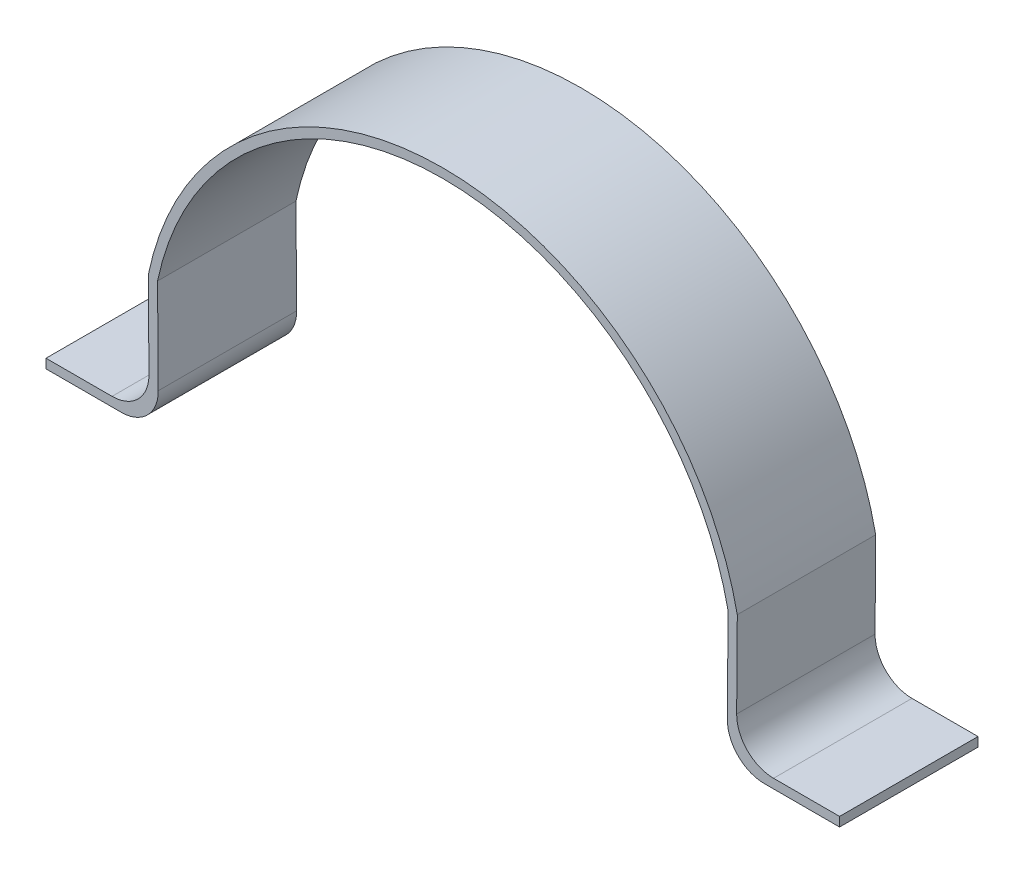
ISO-10303-21;
HEADER;
FILE_DESCRIPTION(('STEP AP214'),'2;1');
FILE_NAME('part.step','',(''),(''),'','','');
FILE_SCHEMA(('AUTOMOTIVE_DESIGN { 1 0 10303 214 1 1 1 1 }'));
ENDSEC;
DATA;
#1=APPLICATION_CONTEXT('core data for automotive mechanical design processes');
#2=APPLICATION_PROTOCOL_DEFINITION('international standard','automotive_design',2000,#1);
#3=PRODUCT_CONTEXT('',#1,'mechanical');
#4=PRODUCT('Part','Part','',(#3));
#5=PRODUCT_RELATED_PRODUCT_CATEGORY('part','',(#4));
#6=PRODUCT_DEFINITION_FORMATION('','',#4);
#7=PRODUCT_DEFINITION_CONTEXT('part definition',#1,'design');
#8=PRODUCT_DEFINITION('design','',#6,#7);
#9=PRODUCT_DEFINITION_SHAPE('','',#8);
#10=(LENGTH_UNIT() NAMED_UNIT(*) SI_UNIT(.MILLI.,.METRE.));
#11=(NAMED_UNIT(*) PLANE_ANGLE_UNIT() SI_UNIT($,.RADIAN.));
#12=(NAMED_UNIT(*) SI_UNIT($,.STERADIAN.) SOLID_ANGLE_UNIT());
#13=UNCERTAINTY_MEASURE_WITH_UNIT(LENGTH_MEASURE(1.E-05),#10,'distance_accuracy_value','');
#14=(GEOMETRIC_REPRESENTATION_CONTEXT(3) GLOBAL_UNCERTAINTY_ASSIGNED_CONTEXT((#13)) GLOBAL_UNIT_ASSIGNED_CONTEXT((#10,
#11,#12)) REPRESENTATION_CONTEXT('',''));
#15=CARTESIAN_POINT('',(0.,0.,0.));
#16=DIRECTION('',(0.,0.,1.));
#17=DIRECTION('',(1.,0.,0.));
#18=AXIS2_PLACEMENT_3D('',#15,#16,#17);
#19=CARTESIAN_POINT('',(31.8191099342966,-7.78341995733945,15.));
#20=DIRECTION('',(0.,1.,0.));
#21=DIRECTION('',(-1.,0.,0.));
#22=AXIS2_PLACEMENT_3D('',#19,#20,#21);
#23=PLANE('',#22);
#24=DIRECTION('',(1.,0.,0.));
#25=VECTOR('',#24,1.);
#26=CARTESIAN_POINT('',(31.8191099342966,-7.78341995733945,15.));
#27=LINE('',#26,#25);
#28=CARTESIAN_POINT('',(34.8414250496166,-7.78341995733945,15.));
#29=VERTEX_POINT('',#28);
#30=CARTESIAN_POINT('',(43.0073590981149,-7.78341995733945,15.));
#31=VERTEX_POINT('',#30);
#32=EDGE_CURVE('E143',#29,#31,#27,.T.);
#33=ORIENTED_EDGE('',*,*,#32,.F.);
#34=DIRECTION('',(0.,0.,-1.));
#35=VECTOR('',#34,1.);
#36=CARTESIAN_POINT('',(34.8414250496166,-7.78341995733945,15.));
#37=LINE('',#36,#35);
#38=CARTESIAN_POINT('',(34.8414250496166,-7.78341995733945,0.));
#39=VERTEX_POINT('',#38);
#40=EDGE_CURVE('E255',#29,#39,#37,.T.);
#41=ORIENTED_EDGE('',*,*,#40,.T.);
#42=DIRECTION('',(1.,0.,0.));
#43=VECTOR('',#42,1.);
#44=CARTESIAN_POINT('',(31.8191099342966,-7.78341995733945,0.));
#45=LINE('',#44,#43);
#46=CARTESIAN_POINT('',(43.0073590981149,-7.78341995733945,0.));
#47=VERTEX_POINT('',#46);
#48=EDGE_CURVE('E158',#39,#47,#45,.T.);
#49=ORIENTED_EDGE('',*,*,#48,.T.);
#50=DIRECTION('',(0.,0.,-1.));
#51=VECTOR('',#50,1.);
#52=CARTESIAN_POINT('',(43.0073590981149,-7.78341995733945,15.));
#53=LINE('',#52,#51);
#54=EDGE_CURVE('E156',#31,#47,#53,.T.);
#55=ORIENTED_EDGE('',*,*,#54,.F.);
#56=EDGE_LOOP('',(#33,#41,#49,#55));
#57=FACE_BOUND('',#56,.T.);
#58=ADVANCED_FACE('F31',(#57),#23,.F.);
#59=CARTESIAN_POINT('',(43.0073590981149,-6.78341995733945,15.));
#60=DIRECTION('',(1.,0.,0.));
#61=DIRECTION('',(0.,0.,-1.));
#62=AXIS2_PLACEMENT_3D('',#59,#60,#61);
#63=PLANE('',#62);
#64=DIRECTION('',(0.,-1.,0.));
#65=VECTOR('',#64,1.);
#66=CARTESIAN_POINT('',(43.0073590981149,-6.78341995733945,0.));
#67=LINE('',#66,#65);
#68=CARTESIAN_POINT('',(43.0073590981149,-6.78341995733945,0.));
#69=VERTEX_POINT('',#68);
#70=EDGE_CURVE('E197',#69,#47,#67,.T.);
#71=ORIENTED_EDGE('',*,*,#70,.F.);
#72=DIRECTION('',(0.,0.,-1.));
#73=VECTOR('',#72,1.);
#74=CARTESIAN_POINT('',(43.0073590981149,-6.78341995733945,15.));
#75=LINE('',#74,#73);
#76=CARTESIAN_POINT('',(43.0073590981149,-6.78341995733945,15.));
#77=VERTEX_POINT('',#76);
#78=EDGE_CURVE('E163',#77,#69,#75,.T.);
#79=ORIENTED_EDGE('',*,*,#78,.F.);
#80=DIRECTION('',(0.,-1.,0.));
#81=VECTOR('',#80,1.);
#82=CARTESIAN_POINT('',(43.0073590981149,-6.78341995733945,15.));
#83=LINE('',#82,#81);
#84=EDGE_CURVE('E148',#77,#31,#83,.T.);
#85=ORIENTED_EDGE('',*,*,#84,.T.);
#86=ORIENTED_EDGE('',*,*,#54,.T.);
#87=EDGE_LOOP('',(#71,#79,#85,#86));
#88=FACE_BOUND('',#87,.T.);
#89=ADVANCED_FACE('F166',(#88),#63,.T.);
#90=CARTESIAN_POINT('',(31.8191099342966,-6.78341995733945,15.));
#91=DIRECTION('',(0.,1.,0.));
#92=DIRECTION('',(-1.,0.,0.));
#93=AXIS2_PLACEMENT_3D('',#90,#91,#92);
#94=PLANE('',#93);
#95=DIRECTION('',(1.,0.,0.));
#96=VECTOR('',#95,1.);
#97=CARTESIAN_POINT('',(31.8191099342966,-6.78341995733945,0.));
#98=LINE('',#97,#96);
#99=CARTESIAN_POINT('',(35.8488634213899,-6.78341995733945,0.));
#100=VERTEX_POINT('',#99);
#101=EDGE_CURVE('E199',#100,#69,#98,.T.);
#102=ORIENTED_EDGE('',*,*,#101,.F.);
#103=DIRECTION('',(0.,0.,-1.));
#104=VECTOR('',#103,1.);
#105=CARTESIAN_POINT('',(35.8488634213899,-6.78341995733945,15.));
#106=LINE('',#105,#104);
#107=CARTESIAN_POINT('',(35.8488634213899,-6.78341995733945,15.));
#108=VERTEX_POINT('',#107);
#109=EDGE_CURVE('E46',#100,#108,#106,.F.);
#110=ORIENTED_EDGE('',*,*,#109,.T.);
#111=DIRECTION('',(1.,0.,0.));
#112=VECTOR('',#111,1.);
#113=CARTESIAN_POINT('',(31.8191099342966,-6.78341995733945,15.));
#114=LINE('',#113,#112);
#115=EDGE_CURVE('E168',#108,#77,#114,.T.);
#116=ORIENTED_EDGE('',*,*,#115,.T.);
#117=ORIENTED_EDGE('',*,*,#78,.T.);
#118=EDGE_LOOP('',(#102,#110,#116,#117));
#119=FACE_BOUND('',#118,.T.);
#120=ADVANCED_FACE('F290',(#119),#94,.T.);
#121=CARTESIAN_POINT('',(31.9183647004848,6.6096381353255,15.));
#122=DIRECTION('',(0.999972540327596,-0.00741070784566578,0.));
#123=DIRECTION('',(0.00741070784566579,0.999972540327596,0.));
#124=AXIS2_PLACEMENT_3D('',#121,#122,#123);
#125=PLANE('',#124);
#126=DIRECTION('',(-0.00741070784566579,-0.999972540327596,0.));
#127=VECTOR('',#126,1.);
#128=CARTESIAN_POINT('',(31.9183647004848,6.6096381353255,15.));
#129=LINE('',#128,#127);
#130=CARTESIAN_POINT('',(31.9183647004848,6.6096381353255,15.));
#131=VERTEX_POINT('',#130);
#132=CARTESIAN_POINT('',(31.8489732600795,-2.75377712595679,15.));
#133=VERTEX_POINT('',#132);
#134=EDGE_CURVE('E170',#131,#133,#129,.T.);
#135=ORIENTED_EDGE('',*,*,#134,.T.);
#136=DIRECTION('',(0.,0.,-1.));
#137=VECTOR('',#136,1.);
#138=CARTESIAN_POINT('',(31.8489732600795,-2.75377712595679,0.));
#139=LINE('',#138,#137);
#140=CARTESIAN_POINT('',(31.8489732600795,-2.75377712595679,0.));
#141=VERTEX_POINT('',#140);
#142=EDGE_CURVE('E259',#133,#141,#139,.T.);
#143=ORIENTED_EDGE('',*,*,#142,.T.);
#144=DIRECTION('',(-0.00741070784566579,-0.999972540327596,0.));
#145=VECTOR('',#144,1.);
#146=CARTESIAN_POINT('',(31.9183647004848,6.6096381353255,0.));
#147=LINE('',#146,#145);
#148=CARTESIAN_POINT('',(31.9183647004848,6.6096381353255,0.));
#149=VERTEX_POINT('',#148);
#150=EDGE_CURVE('E201',#149,#141,#147,.T.);
#151=ORIENTED_EDGE('',*,*,#150,.F.);
#152=DIRECTION('',(0.,0.,-1.));
#153=VECTOR('',#152,1.);
#154=CARTESIAN_POINT('',(31.9183647004848,6.6096381353255,15.));
#155=LINE('',#154,#153);
#156=EDGE_CURVE('E235',#131,#149,#155,.T.);
#157=ORIENTED_EDGE('',*,*,#156,.F.);
#158=EDGE_LOOP('',(#135,#143,#151,#157));
#159=FACE_BOUND('',#158,.T.);
#160=ADVANCED_FACE('F350',(#159),#125,.T.);
#161=CARTESIAN_POINT('',(0.,0.,15.));
#162=DIRECTION('',(0.,0.,-1.));
#163=DIRECTION('',(-1.,0.,0.));
#164=AXIS2_PLACEMENT_3D('',#161,#162,#163);
#165=CYLINDRICAL_SURFACE('',#164,32.5955414348819);
#166=CARTESIAN_POINT('',(0.,0.,0.));
#167=DIRECTION('',(0.,0.,-1.));
#168=DIRECTION('',(1.,0.,0.));
#169=AXIS2_PLACEMENT_3D('',#166,#167,#168);
#170=CIRCLE('',#169,32.5955414348819);
#171=CARTESIAN_POINT('',(-31.9183647004848,6.6096381353255,0.));
#172=VERTEX_POINT('',#171);
#173=EDGE_CURVE('E203',#172,#149,#170,.T.);
#174=ORIENTED_EDGE('',*,*,#173,.F.);
#175=DIRECTION('',(0.,0.,-1.));
#176=VECTOR('',#175,1.);
#177=CARTESIAN_POINT('',(-31.9183647004848,6.6096381353255,15.));
#178=LINE('',#177,#176);
#179=CARTESIAN_POINT('',(-31.9183647004848,6.6096381353255,15.));
#180=VERTEX_POINT('',#179);
#181=EDGE_CURVE('E232',#180,#172,#178,.T.);
#182=ORIENTED_EDGE('',*,*,#181,.F.);
#183=CARTESIAN_POINT('',(0.,0.,15.));
#184=DIRECTION('',(0.,0.,-1.));
#185=DIRECTION('',(1.,0.,0.));
#186=AXIS2_PLACEMENT_3D('',#183,#184,#185);
#187=CIRCLE('',#186,32.5955414348819);
#188=EDGE_CURVE('E175',#180,#131,#187,.T.);
#189=ORIENTED_EDGE('',*,*,#188,.T.);
#190=ORIENTED_EDGE('',*,*,#156,.T.);
#191=EDGE_LOOP('',(#174,#182,#189,#190));
#192=FACE_BOUND('',#191,.T.);
#193=ADVANCED_FACE('F346',(#192),#165,.T.);
#194=CARTESIAN_POINT('',(-31.9183647004848,6.6096381353255,15.));
#195=DIRECTION('',(-0.999972540327596,-0.00741070784566578,0.));
#196=DIRECTION('',(0.00741070784566579,-0.999972540327596,0.));
#197=AXIS2_PLACEMENT_3D('',#194,#195,#196);
#198=PLANE('',#197);
#199=DIRECTION('',(-0.00741070784566579,0.999972540327596,0.));
#200=VECTOR('',#199,1.);
#201=CARTESIAN_POINT('',(-31.9183647004848,6.6096381353255,0.));
#202=LINE('',#201,#200);
#203=CARTESIAN_POINT('',(-31.8489732600795,-2.75377712595679,0.));
#204=VERTEX_POINT('',#203);
#205=EDGE_CURVE('E206',#204,#172,#202,.T.);
#206=ORIENTED_EDGE('',*,*,#205,.F.);
#207=DIRECTION('',(0.,0.,-1.));
#208=VECTOR('',#207,1.);
#209=CARTESIAN_POINT('',(-31.8489732600795,-2.75377712595679,15.));
#210=LINE('',#209,#208);
#211=CARTESIAN_POINT('',(-31.8489732600795,-2.75377712595679,15.));
#212=VERTEX_POINT('',#211);
#213=EDGE_CURVE('E240',#204,#212,#210,.F.);
#214=ORIENTED_EDGE('',*,*,#213,.T.);
#215=DIRECTION('',(-0.00741070784566579,0.999972540327596,0.));
#216=VECTOR('',#215,1.);
#217=CARTESIAN_POINT('',(-31.9183647004848,6.6096381353255,15.));
#218=LINE('',#217,#216);
#219=EDGE_CURVE('E178',#212,#180,#218,.T.);
#220=ORIENTED_EDGE('',*,*,#219,.T.);
#221=ORIENTED_EDGE('',*,*,#181,.T.);
#222=EDGE_LOOP('',(#206,#214,#220,#221));
#223=FACE_BOUND('',#222,.T.);
#224=ADVANCED_FACE('F343',(#223),#198,.T.);
#225=CARTESIAN_POINT('',(-31.8191099342966,-6.78341995733945,15.));
#226=DIRECTION('',(0.,1.,0.));
#227=DIRECTION('',(-1.,0.,0.));
#228=AXIS2_PLACEMENT_3D('',#225,#226,#227);
#229=PLANE('',#228);
#230=DIRECTION('',(1.,0.,0.));
#231=VECTOR('',#230,1.);
#232=CARTESIAN_POINT('',(-31.8191099342966,-6.78341995733945,15.));
#233=LINE('',#232,#231);
#234=CARTESIAN_POINT('',(-43.0073590981149,-6.78341995733945,15.));
#235=VERTEX_POINT('',#234);
#236=CARTESIAN_POINT('',(-35.8488634213899,-6.78341995733945,15.));
#237=VERTEX_POINT('',#236);
#238=EDGE_CURVE('E180',#235,#237,#233,.T.);
#239=ORIENTED_EDGE('',*,*,#238,.T.);
#240=DIRECTION('',(0.,0.,-1.));
#241=VECTOR('',#240,1.);
#242=CARTESIAN_POINT('',(-35.8488634213899,-6.78341995733945,0.));
#243=LINE('',#242,#241);
#244=CARTESIAN_POINT('',(-35.8488634213899,-6.78341995733945,0.));
#245=VERTEX_POINT('',#244);
#246=EDGE_CURVE('E162',#237,#245,#243,.T.);
#247=ORIENTED_EDGE('',*,*,#246,.T.);
#248=DIRECTION('',(1.,0.,0.));
#249=VECTOR('',#248,1.);
#250=CARTESIAN_POINT('',(-31.8191099342966,-6.78341995733945,0.));
#251=LINE('',#250,#249);
#252=CARTESIAN_POINT('',(-43.0073590981149,-6.78341995733945,0.));
#253=VERTEX_POINT('',#252);
#254=EDGE_CURVE('E208',#253,#245,#251,.T.);
#255=ORIENTED_EDGE('',*,*,#254,.F.);
#256=DIRECTION('',(0.,0.,-1.));
#257=VECTOR('',#256,1.);
#258=CARTESIAN_POINT('',(-43.0073590981149,-6.78341995733945,15.));
#259=LINE('',#258,#257);
#260=EDGE_CURVE('E230',#235,#253,#259,.T.);
#261=ORIENTED_EDGE('',*,*,#260,.F.);
#262=EDGE_LOOP('',(#239,#247,#255,#261));
#263=FACE_BOUND('',#262,.T.);
#264=ADVANCED_FACE('F308',(#263),#229,.T.);
#265=CARTESIAN_POINT('',(-43.0073590981149,-7.78341995733945,15.));
#266=DIRECTION('',(-1.,0.,0.));
#267=DIRECTION('',(0.,0.,1.));
#268=AXIS2_PLACEMENT_3D('',#265,#266,#267);
#269=PLANE('',#268);
#270=DIRECTION('',(0.,1.,0.));
#271=VECTOR('',#270,1.);
#272=CARTESIAN_POINT('',(-43.0073590981149,-7.78341995733945,0.));
#273=LINE('',#272,#271);
#274=CARTESIAN_POINT('',(-43.0073590981149,-7.78341995733945,0.));
#275=VERTEX_POINT('',#274);
#276=EDGE_CURVE('E211',#275,#253,#273,.T.);
#277=ORIENTED_EDGE('',*,*,#276,.F.);
#278=DIRECTION('',(0.,0.,-1.));
#279=VECTOR('',#278,1.);
#280=CARTESIAN_POINT('',(-43.0073590981149,-7.78341995733945,15.));
#281=LINE('',#280,#279);
#282=CARTESIAN_POINT('',(-43.0073590981149,-7.78341995733945,15.));
#283=VERTEX_POINT('',#282);
#284=EDGE_CURVE('E228',#283,#275,#281,.T.);
#285=ORIENTED_EDGE('',*,*,#284,.F.);
#286=DIRECTION('',(0.,1.,0.));
#287=VECTOR('',#286,1.);
#288=CARTESIAN_POINT('',(-43.0073590981149,-7.78341995733945,15.));
#289=LINE('',#288,#287);
#290=EDGE_CURVE('E183',#283,#235,#289,.T.);
#291=ORIENTED_EDGE('',*,*,#290,.T.);
#292=ORIENTED_EDGE('',*,*,#260,.T.);
#293=EDGE_LOOP('',(#277,#285,#291,#292));
#294=FACE_BOUND('',#293,.T.);
#295=ADVANCED_FACE('F312',(#294),#269,.T.);
#296=CARTESIAN_POINT('',(-31.8191099342966,-7.78341995733945,15.));
#297=DIRECTION('',(0.,1.,0.));
#298=DIRECTION('',(-1.,0.,0.));
#299=AXIS2_PLACEMENT_3D('',#296,#297,#298);
#300=PLANE('',#299);
#301=DIRECTION('',(1.,0.,0.));
#302=VECTOR('',#301,1.);
#303=CARTESIAN_POINT('',(-31.8191099342966,-7.78341995733945,0.));
#304=LINE('',#303,#302);
#305=CARTESIAN_POINT('',(-34.8414250496166,-7.78341995733945,0.));
#306=VERTEX_POINT('',#305);
#307=EDGE_CURVE('E214',#275,#306,#304,.T.);
#308=ORIENTED_EDGE('',*,*,#307,.T.);
#309=DIRECTION('',(0.,0.,-1.));
#310=VECTOR('',#309,1.);
#311=CARTESIAN_POINT('',(-34.8414250496166,-7.78341995733945,15.));
#312=LINE('',#311,#310);
#313=CARTESIAN_POINT('',(-34.8414250496166,-7.78341995733945,15.));
#314=VERTEX_POINT('',#313);
#315=EDGE_CURVE('E251',#306,#314,#312,.F.);
#316=ORIENTED_EDGE('',*,*,#315,.T.);
#317=DIRECTION('',(1.,0.,0.));
#318=VECTOR('',#317,1.);
#319=CARTESIAN_POINT('',(-31.8191099342966,-7.78341995733945,15.));
#320=LINE('',#319,#318);
#321=EDGE_CURVE('E186',#283,#314,#320,.T.);
#322=ORIENTED_EDGE('',*,*,#321,.F.);
#323=ORIENTED_EDGE('',*,*,#284,.T.);
#324=EDGE_LOOP('',(#308,#316,#322,#323));
#325=FACE_BOUND('',#324,.T.);
#326=ADVANCED_FACE('F334',(#325),#300,.F.);
#327=CARTESIAN_POINT('',(-30.9183921601572,6.61704884317116,15.));
#328=DIRECTION('',(-0.999972540327596,-0.00741070784566578,0.));
#329=DIRECTION('',(0.00741070784566578,-0.999972540327596,0.));
#330=AXIS2_PLACEMENT_3D('',#327,#328,#329);
#331=PLANE('',#330);
#332=DIRECTION('',(-0.00741070784566578,0.999972540327596,0.));
#333=VECTOR('',#332,1.);
#334=CARTESIAN_POINT('',(-30.9183921601572,6.61704884317116,15.));
#335=LINE('',#334,#333);
#336=CARTESIAN_POINT('',(-30.8415348883062,-3.75377712595679,15.));
#337=VERTEX_POINT('',#336);
#338=CARTESIAN_POINT('',(-30.9175989522455,6.51001640485201,15.));
#339=VERTEX_POINT('',#338);
#340=EDGE_CURVE('E189',#337,#339,#335,.T.);
#341=ORIENTED_EDGE('',*,*,#340,.F.);
#342=DIRECTION('',(0.,0.,-1.));
#343=VECTOR('',#342,1.);
#344=CARTESIAN_POINT('',(-30.8415348883062,-3.75377712595679,15.));
#345=LINE('',#344,#343);
#346=CARTESIAN_POINT('',(-30.8415348883062,-3.75377712595679,0.));
#347=VERTEX_POINT('',#346);
#348=EDGE_CURVE('E246',#337,#347,#345,.T.);
#349=ORIENTED_EDGE('',*,*,#348,.T.);
#350=DIRECTION('',(-0.00741070784566578,0.999972540327596,0.));
#351=VECTOR('',#350,1.);
#352=CARTESIAN_POINT('',(-30.9183921601572,6.61704884317116,0.));
#353=LINE('',#352,#351);
#354=CARTESIAN_POINT('',(-30.9175989522455,6.51001640485201,0.));
#355=VERTEX_POINT('',#354);
#356=EDGE_CURVE('E217',#347,#355,#353,.T.);
#357=ORIENTED_EDGE('',*,*,#356,.T.);
#358=DIRECTION('',(0.,0.,-1.));
#359=VECTOR('',#358,1.);
#360=CARTESIAN_POINT('',(-30.9175989522455,6.51001640485201,15.));
#361=LINE('',#360,#359);
#362=EDGE_CURVE('E225',#339,#355,#361,.T.);
#363=ORIENTED_EDGE('',*,*,#362,.F.);
#364=EDGE_LOOP('',(#341,#349,#357,#363));
#365=FACE_BOUND('',#364,.T.);
#366=ADVANCED_FACE('F321',(#365),#331,.F.);
#367=CARTESIAN_POINT('',(0.,0.,15.));
#368=DIRECTION('',(0.,0.,-1.));
#369=DIRECTION('',(-1.,0.,0.));
#370=AXIS2_PLACEMENT_3D('',#367,#368,#369);
#371=CYLINDRICAL_SURFACE('',#370,31.5955414348819);
#372=CARTESIAN_POINT('',(0.,0.,0.));
#373=DIRECTION('',(0.,0.,1.));
#374=DIRECTION('',(1.,0.,0.));
#375=AXIS2_PLACEMENT_3D('',#372,#373,#374);
#376=CIRCLE('',#375,31.5955414348819);
#377=CARTESIAN_POINT('',(30.9175989522455,6.51001640485201,0.));
#378=VERTEX_POINT('',#377);
#379=EDGE_CURVE('E219',#355,#378,#376,.F.);
#380=ORIENTED_EDGE('',*,*,#379,.T.);
#381=DIRECTION('',(0.,0.,-1.));
#382=VECTOR('',#381,1.);
#383=CARTESIAN_POINT('',(30.9175989522455,6.51001640485201,15.));
#384=LINE('',#383,#382);
#385=CARTESIAN_POINT('',(30.9175989522455,6.51001640485201,15.));
#386=VERTEX_POINT('',#385);
#387=EDGE_CURVE('E195',#386,#378,#384,.T.);
#388=ORIENTED_EDGE('',*,*,#387,.F.);
#389=CARTESIAN_POINT('',(0.,0.,15.));
#390=DIRECTION('',(0.,0.,1.));
#391=DIRECTION('',(1.,0.,0.));
#392=AXIS2_PLACEMENT_3D('',#389,#390,#391);
#393=CIRCLE('',#392,31.5955414348819);
#394=EDGE_CURVE('E191',#339,#386,#393,.F.);
#395=ORIENTED_EDGE('',*,*,#394,.F.);
#396=ORIENTED_EDGE('',*,*,#362,.T.);
#397=EDGE_LOOP('',(#380,#388,#395,#396));
#398=FACE_BOUND('',#397,.T.);
#399=ADVANCED_FACE('F325',(#398),#371,.F.);
#400=CARTESIAN_POINT('',(30.9183921601572,6.61704884317116,15.));
#401=DIRECTION('',(0.999972540327596,-0.00741070784566578,0.));
#402=DIRECTION('',(0.00741070784566578,0.999972540327596,0.));
#403=AXIS2_PLACEMENT_3D('',#400,#401,#402);
#404=PLANE('',#403);
#405=DIRECTION('',(-0.00741070784566578,-0.999972540327596,0.));
#406=VECTOR('',#405,1.);
#407=CARTESIAN_POINT('',(30.9183921601572,6.61704884317116,0.));
#408=LINE('',#407,#406);
#409=CARTESIAN_POINT('',(30.8415348883062,-3.75377712595679,0.));
#410=VERTEX_POINT('',#409);
#411=EDGE_CURVE('E153',#378,#410,#408,.T.);
#412=ORIENTED_EDGE('',*,*,#411,.T.);
#413=DIRECTION('',(0.,0.,-1.));
#414=VECTOR('',#413,1.);
#415=CARTESIAN_POINT('',(30.8415348883062,-3.75377712595679,15.));
#416=LINE('',#415,#414);
#417=CARTESIAN_POINT('',(30.8415348883062,-3.75377712595679,15.));
#418=VERTEX_POINT('',#417);
#419=EDGE_CURVE('E257',#410,#418,#416,.F.);
#420=ORIENTED_EDGE('',*,*,#419,.T.);
#421=DIRECTION('',(-0.00741070784566578,-0.999972540327596,0.));
#422=VECTOR('',#421,1.);
#423=CARTESIAN_POINT('',(30.9183921601572,6.61704884317116,15.));
#424=LINE('',#423,#422);
#425=EDGE_CURVE('E193',#386,#418,#424,.T.);
#426=ORIENTED_EDGE('',*,*,#425,.F.);
#427=ORIENTED_EDGE('',*,*,#387,.T.);
#428=EDGE_LOOP('',(#412,#420,#426,#427));
#429=FACE_BOUND('',#428,.T.);
#430=ADVANCED_FACE('F271',(#429),#404,.F.);
#431=CARTESIAN_POINT('',(0.,0.,15.));
#432=DIRECTION('',(0.,0.,-1.));
#433=DIRECTION('',(-1.,0.,0.));
#434=AXIS2_PLACEMENT_3D('',#431,#432,#433);
#435=PLANE('',#434);
#436=ORIENTED_EDGE('',*,*,#425,.T.);
#437=CARTESIAN_POINT('',(34.8414250496166,-3.78341995733945,15.));
#438=DIRECTION('',(0.,0.,-1.));
#439=DIRECTION('',(-1.,0.,0.));
#440=AXIS2_PLACEMENT_3D('',#437,#438,#439);
#441=CIRCLE('',#440,4.);
#442=EDGE_CURVE('E11',#418,#29,#441,.F.);
#443=ORIENTED_EDGE('',*,*,#442,.T.);
#444=ORIENTED_EDGE('',*,*,#32,.T.);
#445=ORIENTED_EDGE('',*,*,#84,.F.);
#446=ORIENTED_EDGE('',*,*,#115,.F.);
#447=CARTESIAN_POINT('',(35.8488634213899,-2.78341995733945,15.));
#448=DIRECTION('',(0.,0.,-1.));
#449=DIRECTION('',(-1.,0.,0.));
#450=AXIS2_PLACEMENT_3D('',#447,#448,#449);
#451=CIRCLE('',#450,4.);
#452=EDGE_CURVE('E264',#108,#133,#451,.T.);
#453=ORIENTED_EDGE('',*,*,#452,.T.);
#454=ORIENTED_EDGE('',*,*,#134,.F.);
#455=ORIENTED_EDGE('',*,*,#188,.F.);
#456=ORIENTED_EDGE('',*,*,#219,.F.);
#457=CARTESIAN_POINT('',(-35.8488634213899,-2.78341995733945,15.));
#458=DIRECTION('',(0.,0.,-1.));
#459=DIRECTION('',(-1.,0.,0.));
#460=AXIS2_PLACEMENT_3D('',#457,#458,#459);
#461=CIRCLE('',#460,4.);
#462=EDGE_CURVE('E244',#212,#237,#461,.T.);
#463=ORIENTED_EDGE('',*,*,#462,.T.);
#464=ORIENTED_EDGE('',*,*,#238,.F.);
#465=ORIENTED_EDGE('',*,*,#290,.F.);
#466=ORIENTED_EDGE('',*,*,#321,.T.);
#467=CARTESIAN_POINT('',(-34.8414250496166,-3.78341995733945,15.));
#468=DIRECTION('',(0.,0.,-1.));
#469=DIRECTION('',(-1.,0.,0.));
#470=AXIS2_PLACEMENT_3D('',#467,#468,#469);
#471=CIRCLE('',#470,4.);
#472=EDGE_CURVE('E253',#314,#337,#471,.F.);
#473=ORIENTED_EDGE('',*,*,#472,.T.);
#474=ORIENTED_EDGE('',*,*,#340,.T.);
#475=ORIENTED_EDGE('',*,*,#394,.T.);
#476=EDGE_LOOP('',(#436,#443,#444,#445,#446,#453,#454,#455,#456,#463,#464,#465,#466,#473,#474,#475));
#477=FACE_BOUND('',#476,.T.);
#478=ADVANCED_FACE('F146',(#477),#435,.F.);
#479=CARTESIAN_POINT('',(0.,0.,0.));
#480=DIRECTION('',(0.,0.,-1.));
#481=DIRECTION('',(-1.,0.,0.));
#482=AXIS2_PLACEMENT_3D('',#479,#480,#481);
#483=PLANE('',#482);
#484=ORIENTED_EDGE('',*,*,#48,.F.);
#485=CARTESIAN_POINT('',(34.8414250496166,-3.78341995733945,0.));
#486=DIRECTION('',(0.,0.,-1.));
#487=DIRECTION('',(-1.,0.,0.));
#488=AXIS2_PLACEMENT_3D('',#485,#486,#487);
#489=CIRCLE('',#488,4.);
#490=EDGE_CURVE('E39',#39,#410,#489,.T.);
#491=ORIENTED_EDGE('',*,*,#490,.T.);
#492=ORIENTED_EDGE('',*,*,#411,.F.);
#493=ORIENTED_EDGE('',*,*,#379,.F.);
#494=ORIENTED_EDGE('',*,*,#356,.F.);
#495=CARTESIAN_POINT('',(-34.8414250496166,-3.78341995733945,0.));
#496=DIRECTION('',(0.,0.,-1.));
#497=DIRECTION('',(-1.,0.,0.));
#498=AXIS2_PLACEMENT_3D('',#495,#496,#497);
#499=CIRCLE('',#498,4.);
#500=EDGE_CURVE('E249',#347,#306,#499,.T.);
#501=ORIENTED_EDGE('',*,*,#500,.T.);
#502=ORIENTED_EDGE('',*,*,#307,.F.);
#503=ORIENTED_EDGE('',*,*,#276,.T.);
#504=ORIENTED_EDGE('',*,*,#254,.T.);
#505=CARTESIAN_POINT('',(-35.8488634213899,-2.78341995733945,0.));
#506=DIRECTION('',(0.,0.,-1.));
#507=DIRECTION('',(-1.,0.,0.));
#508=AXIS2_PLACEMENT_3D('',#505,#506,#507);
#509=CIRCLE('',#508,4.);
#510=EDGE_CURVE('E242',#245,#204,#509,.F.);
#511=ORIENTED_EDGE('',*,*,#510,.T.);
#512=ORIENTED_EDGE('',*,*,#205,.T.);
#513=ORIENTED_EDGE('',*,*,#173,.T.);
#514=ORIENTED_EDGE('',*,*,#150,.T.);
#515=CARTESIAN_POINT('',(35.8488634213899,-2.78341995733945,0.));
#516=DIRECTION('',(0.,0.,-1.));
#517=DIRECTION('',(-1.,0.,0.));
#518=AXIS2_PLACEMENT_3D('',#515,#516,#517);
#519=CIRCLE('',#518,4.);
#520=EDGE_CURVE('E54',#141,#100,#519,.F.);
#521=ORIENTED_EDGE('',*,*,#520,.T.);
#522=ORIENTED_EDGE('',*,*,#101,.T.);
#523=ORIENTED_EDGE('',*,*,#70,.T.);
#524=EDGE_LOOP('',(#484,#491,#492,#493,#494,#501,#502,#503,#504,#511,#512,#513,#514,#521,#522,#523));
#525=FACE_BOUND('',#524,.T.);
#526=ADVANCED_FACE('F266',(#525),#483,.T.);
#527=CARTESIAN_POINT('',(-35.8488634213899,-2.78341995733945,15.));
#528=DIRECTION('',(0.,0.,1.));
#529=DIRECTION('',(1.,0.,0.));
#530=AXIS2_PLACEMENT_3D('',#527,#528,#529);
#531=CYLINDRICAL_SURFACE('',#530,4.);
#532=ORIENTED_EDGE('',*,*,#462,.F.);
#533=ORIENTED_EDGE('',*,*,#213,.F.);
#534=ORIENTED_EDGE('',*,*,#510,.F.);
#535=ORIENTED_EDGE('',*,*,#246,.F.);
#536=EDGE_LOOP('',(#532,#533,#534,#535));
#537=FACE_BOUND('',#536,.T.);
#538=ADVANCED_FACE('F282',(#537),#531,.F.);
#539=CARTESIAN_POINT('',(-34.8414250496166,-3.78341995733945,15.));
#540=DIRECTION('',(0.,0.,-1.));
#541=DIRECTION('',(-1.,0.,0.));
#542=AXIS2_PLACEMENT_3D('',#539,#540,#541);
#543=CYLINDRICAL_SURFACE('',#542,4.);
#544=ORIENTED_EDGE('',*,*,#472,.F.);
#545=ORIENTED_EDGE('',*,*,#315,.F.);
#546=ORIENTED_EDGE('',*,*,#500,.F.);
#547=ORIENTED_EDGE('',*,*,#348,.F.);
#548=EDGE_LOOP('',(#544,#545,#546,#547));
#549=FACE_BOUND('',#548,.T.);
#550=ADVANCED_FACE('F276',(#549),#543,.T.);
#551=CARTESIAN_POINT('',(34.8414250496166,-3.78341995733945,15.));
#552=DIRECTION('',(0.,0.,-1.));
#553=DIRECTION('',(-1.,0.,0.));
#554=AXIS2_PLACEMENT_3D('',#551,#552,#553);
#555=CYLINDRICAL_SURFACE('',#554,4.);
#556=ORIENTED_EDGE('',*,*,#442,.F.);
#557=ORIENTED_EDGE('',*,*,#419,.F.);
#558=ORIENTED_EDGE('',*,*,#490,.F.);
#559=ORIENTED_EDGE('',*,*,#40,.F.);
#560=EDGE_LOOP('',(#556,#557,#558,#559));
#561=FACE_BOUND('',#560,.T.);
#562=ADVANCED_FACE('F274',(#561),#555,.T.);
#563=CARTESIAN_POINT('',(35.8488634213899,-2.78341995733945,15.));
#564=DIRECTION('',(0.,0.,1.));
#565=DIRECTION('',(1.,0.,0.));
#566=AXIS2_PLACEMENT_3D('',#563,#564,#565);
#567=CYLINDRICAL_SURFACE('',#566,4.);
#568=ORIENTED_EDGE('',*,*,#452,.F.);
#569=ORIENTED_EDGE('',*,*,#109,.F.);
#570=ORIENTED_EDGE('',*,*,#520,.F.);
#571=ORIENTED_EDGE('',*,*,#142,.F.);
#572=EDGE_LOOP('',(#568,#569,#570,#571));
#573=FACE_BOUND('',#572,.T.);
#574=ADVANCED_FACE('F33',(#573),#567,.F.);
#575=CLOSED_SHELL('',(#58,#89,#120,#160,#193,#224,#264,#295,#326,#366,#399,#430,#478,#526,#538,
#550,#562,#574));
#576=MANIFOLD_SOLID_BREP('B2',#575);
#577=ADVANCED_BREP_SHAPE_REPRESENTATION('',(#18,#576),#14);
#578=SHAPE_DEFINITION_REPRESENTATION(#9,#577);
ENDSEC;
END-ISO-10303-21;
